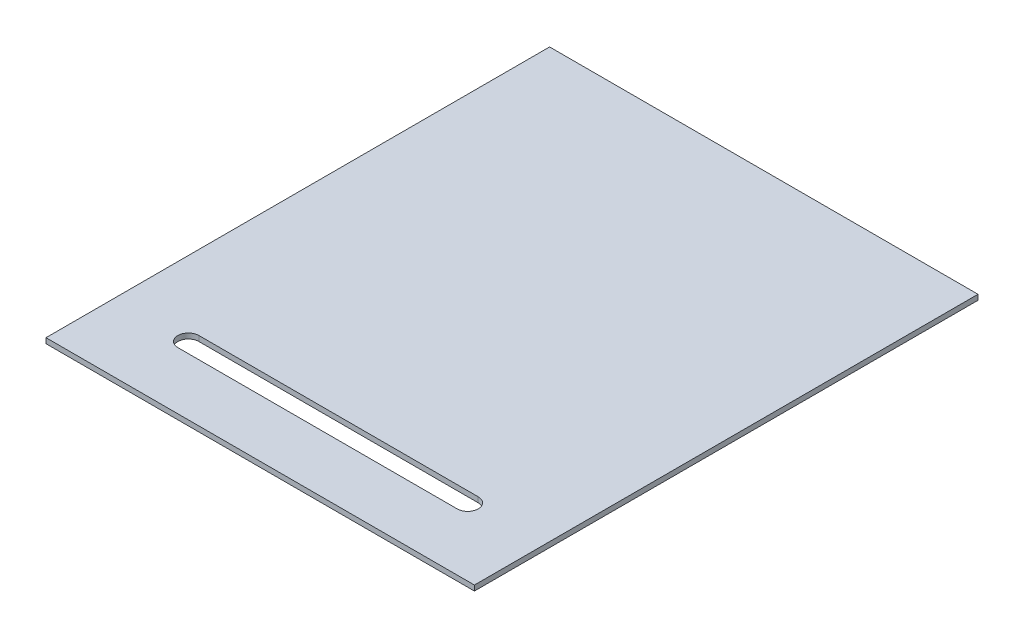
ISO-10303-21;
HEADER;
FILE_DESCRIPTION(('STEP AP214'),'2;1');
FILE_NAME('part.step','',(''),(''),'','','');
FILE_SCHEMA(('AUTOMOTIVE_DESIGN { 1 0 10303 214 1 1 1 1 }'));
ENDSEC;
DATA;
#1=APPLICATION_CONTEXT('core data for automotive mechanical design processes');
#2=APPLICATION_PROTOCOL_DEFINITION('international standard','automotive_design',2000,#1);
#3=PRODUCT_CONTEXT('',#1,'mechanical');
#4=PRODUCT('Part','Part','',(#3));
#5=PRODUCT_RELATED_PRODUCT_CATEGORY('part','',(#4));
#6=PRODUCT_DEFINITION_FORMATION('','',#4);
#7=PRODUCT_DEFINITION_CONTEXT('part definition',#1,'design');
#8=PRODUCT_DEFINITION('design','',#6,#7);
#9=PRODUCT_DEFINITION_SHAPE('','',#8);
#10=(LENGTH_UNIT() NAMED_UNIT(*) SI_UNIT(.MILLI.,.METRE.));
#11=(NAMED_UNIT(*) PLANE_ANGLE_UNIT() SI_UNIT($,.RADIAN.));
#12=(NAMED_UNIT(*) SI_UNIT($,.STERADIAN.) SOLID_ANGLE_UNIT());
#13=UNCERTAINTY_MEASURE_WITH_UNIT(LENGTH_MEASURE(1.E-05),#10,'distance_accuracy_value','');
#14=(GEOMETRIC_REPRESENTATION_CONTEXT(3) GLOBAL_UNCERTAINTY_ASSIGNED_CONTEXT((#13)) GLOBAL_UNIT_ASSIGNED_CONTEXT((#10,
#11,#12)) REPRESENTATION_CONTEXT('',''));
#15=CARTESIAN_POINT('',(0.,0.,0.));
#16=DIRECTION('',(0.,0.,1.));
#17=DIRECTION('',(1.,0.,0.));
#18=AXIS2_PLACEMENT_3D('',#15,#16,#17);
#19=CARTESIAN_POINT('',(0.,3.175,0.));
#20=DIRECTION('',(0.,1.,0.));
#21=DIRECTION('',(0.,0.,1.));
#22=AXIS2_PLACEMENT_3D('',#19,#20,#21);
#23=PLANE('',#22);
#24=DIRECTION('',(0.,0.,-1.));
#25=VECTOR('',#24,1.);
#26=CARTESIAN_POINT('',(129.54,3.175,-152.273));
#27=LINE('',#26,#25);
#28=CARTESIAN_POINT('',(129.54,3.175,152.273));
#29=VERTEX_POINT('',#28);
#30=CARTESIAN_POINT('',(129.54,3.175,-152.273));
#31=VERTEX_POINT('',#30);
#32=EDGE_CURVE('E157',#29,#31,#27,.T.);
#33=ORIENTED_EDGE('',*,*,#32,.T.);
#34=DIRECTION('',(-1.,0.,0.));
#35=VECTOR('',#34,1.);
#36=CARTESIAN_POINT('',(-129.54,3.175,-152.273));
#37=LINE('',#36,#35);
#38=CARTESIAN_POINT('',(-129.54,3.175,-152.273));
#39=VERTEX_POINT('',#38);
#40=EDGE_CURVE('E161',#31,#39,#37,.T.);
#41=ORIENTED_EDGE('',*,*,#40,.T.);
#42=DIRECTION('',(0.,0.,1.));
#43=VECTOR('',#42,1.);
#44=CARTESIAN_POINT('',(-129.54,3.175,-152.273));
#45=LINE('',#44,#43);
#46=CARTESIAN_POINT('',(-129.54,3.175,152.273));
#47=VERTEX_POINT('',#46);
#48=EDGE_CURVE('E165',#39,#47,#45,.T.);
#49=ORIENTED_EDGE('',*,*,#48,.T.);
#50=DIRECTION('',(1.,0.,0.));
#51=VECTOR('',#50,1.);
#52=CARTESIAN_POINT('',(-129.54,3.175,152.273));
#53=LINE('',#52,#51);
#54=EDGE_CURVE('E168',#47,#29,#53,.T.);
#55=ORIENTED_EDGE('',*,*,#54,.T.);
#56=EDGE_LOOP('',(#33,#41,#49,#55));
#57=FACE_BOUND('',#56,.T.);
#58=DIRECTION('',(1.,0.,0.));
#59=VECTOR('',#58,1.);
#60=CARTESIAN_POINT('',(-84.455,3.175,117.602));
#61=LINE('',#60,#59);
#62=CARTESIAN_POINT('',(-84.455,3.175,117.602));
#63=VERTEX_POINT('',#62);
#64=CARTESIAN_POINT('',(84.455,3.175,117.602));
#65=VERTEX_POINT('',#64);
#66=EDGE_CURVE('E118',#63,#65,#61,.T.);
#67=ORIENTED_EDGE('',*,*,#66,.F.);
#68=CARTESIAN_POINT('',(-84.455,3.175,111.252));
#69=DIRECTION('',(0.,1.,0.));
#70=DIRECTION('',(0.,0.,1.));
#71=AXIS2_PLACEMENT_3D('',#68,#69,#70);
#72=CIRCLE('',#71,6.34999999999999);
#73=CARTESIAN_POINT('',(-84.455,3.175,104.902));
#74=VERTEX_POINT('',#73);
#75=EDGE_CURVE('E109',#74,#63,#72,.T.);
#76=ORIENTED_EDGE('',*,*,#75,.F.);
#77=DIRECTION('',(-1.,0.,0.));
#78=VECTOR('',#77,1.);
#79=CARTESIAN_POINT('',(-84.455,3.175,104.902));
#80=LINE('',#79,#78);
#81=CARTESIAN_POINT('',(84.455,3.175,104.902));
#82=VERTEX_POINT('',#81);
#83=EDGE_CURVE('E135',#82,#74,#80,.T.);
#84=ORIENTED_EDGE('',*,*,#83,.F.);
#85=CARTESIAN_POINT('',(84.455,3.175,111.252));
#86=DIRECTION('',(0.,1.,0.));
#87=DIRECTION('',(0.,0.,1.));
#88=AXIS2_PLACEMENT_3D('',#85,#86,#87);
#89=CIRCLE('',#88,6.34999999999999);
#90=EDGE_CURVE('E131',#65,#82,#89,.T.);
#91=ORIENTED_EDGE('',*,*,#90,.F.);
#92=EDGE_LOOP('',(#67,#76,#84,#91));
#93=FACE_BOUND('',#92,.T.);
#94=ADVANCED_FACE('F43',(#57,#93),#23,.T.);
#95=CARTESIAN_POINT('',(0.,0.,0.));
#96=DIRECTION('',(0.,1.,0.));
#97=DIRECTION('',(0.,0.,1.));
#98=AXIS2_PLACEMENT_3D('',#95,#96,#97);
#99=PLANE('',#98);
#100=DIRECTION('',(0.,0.,-1.));
#101=VECTOR('',#100,1.);
#102=CARTESIAN_POINT('',(129.54,0.,-152.273));
#103=LINE('',#102,#101);
#104=CARTESIAN_POINT('',(129.54,0.,152.273));
#105=VERTEX_POINT('',#104);
#106=CARTESIAN_POINT('',(129.54,0.,-152.273));
#107=VERTEX_POINT('',#106);
#108=EDGE_CURVE('E127',#105,#107,#103,.T.);
#109=ORIENTED_EDGE('',*,*,#108,.F.);
#110=DIRECTION('',(1.,0.,0.));
#111=VECTOR('',#110,1.);
#112=CARTESIAN_POINT('',(-129.54,0.,152.273));
#113=LINE('',#112,#111);
#114=CARTESIAN_POINT('',(-129.54,0.,152.273));
#115=VERTEX_POINT('',#114);
#116=EDGE_CURVE('E162',#115,#105,#113,.T.);
#117=ORIENTED_EDGE('',*,*,#116,.F.);
#118=DIRECTION('',(0.,0.,1.));
#119=VECTOR('',#118,1.);
#120=CARTESIAN_POINT('',(-129.54,0.,-152.273));
#121=LINE('',#120,#119);
#122=CARTESIAN_POINT('',(-129.54,0.,-152.273));
#123=VERTEX_POINT('',#122);
#124=EDGE_CURVE('E178',#123,#115,#121,.T.);
#125=ORIENTED_EDGE('',*,*,#124,.F.);
#126=DIRECTION('',(-1.,0.,0.));
#127=VECTOR('',#126,1.);
#128=CARTESIAN_POINT('',(-129.54,0.,-152.273));
#129=LINE('',#128,#127);
#130=EDGE_CURVE('E175',#107,#123,#129,.T.);
#131=ORIENTED_EDGE('',*,*,#130,.F.);
#132=EDGE_LOOP('',(#109,#117,#125,#131));
#133=FACE_BOUND('',#132,.T.);
#134=CARTESIAN_POINT('',(-84.455,0.,111.252));
#135=DIRECTION('',(0.,1.,0.));
#136=DIRECTION('',(0.,0.,1.));
#137=AXIS2_PLACEMENT_3D('',#134,#135,#136);
#138=CIRCLE('',#137,6.34999999999999);
#139=CARTESIAN_POINT('',(-84.455,0.,104.902));
#140=VERTEX_POINT('',#139);
#141=CARTESIAN_POINT('',(-84.455,0.,117.602));
#142=VERTEX_POINT('',#141);
#143=EDGE_CURVE('E67',#140,#142,#138,.T.);
#144=ORIENTED_EDGE('',*,*,#143,.T.);
#145=DIRECTION('',(1.,0.,0.));
#146=VECTOR('',#145,1.);
#147=CARTESIAN_POINT('',(-84.455,0.,117.602));
#148=LINE('',#147,#146);
#149=CARTESIAN_POINT('',(84.455,0.,117.602));
#150=VERTEX_POINT('',#149);
#151=EDGE_CURVE('E125',#142,#150,#148,.T.);
#152=ORIENTED_EDGE('',*,*,#151,.T.);
#153=CARTESIAN_POINT('',(84.455,0.,111.252));
#154=DIRECTION('',(0.,1.,0.));
#155=DIRECTION('',(0.,0.,1.));
#156=AXIS2_PLACEMENT_3D('',#153,#154,#155);
#157=CIRCLE('',#156,6.34999999999999);
#158=CARTESIAN_POINT('',(84.455,0.,104.902));
#159=VERTEX_POINT('',#158);
#160=EDGE_CURVE('E144',#150,#159,#157,.T.);
#161=ORIENTED_EDGE('',*,*,#160,.T.);
#162=DIRECTION('',(-1.,0.,0.));
#163=VECTOR('',#162,1.);
#164=CARTESIAN_POINT('',(-84.455,0.,104.902));
#165=LINE('',#164,#163);
#166=EDGE_CURVE('E119',#159,#140,#165,.T.);
#167=ORIENTED_EDGE('',*,*,#166,.T.);
#168=EDGE_LOOP('',(#144,#152,#161,#167));
#169=FACE_BOUND('',#168,.T.);
#170=ADVANCED_FACE('F201',(#133,#169),#99,.F.);
#171=CARTESIAN_POINT('',(129.54,3.175,-152.273));
#172=DIRECTION('',(-1.,0.,0.));
#173=DIRECTION('',(0.,0.,1.));
#174=AXIS2_PLACEMENT_3D('',#171,#172,#173);
#175=PLANE('',#174);
#176=ORIENTED_EDGE('',*,*,#108,.T.);
#177=DIRECTION('',(0.,-1.,0.));
#178=VECTOR('',#177,1.);
#179=CARTESIAN_POINT('',(129.54,3.175,-152.273));
#180=LINE('',#179,#178);
#181=EDGE_CURVE('E11',#31,#107,#180,.T.);
#182=ORIENTED_EDGE('',*,*,#181,.F.);
#183=ORIENTED_EDGE('',*,*,#32,.F.);
#184=DIRECTION('',(0.,-1.,0.));
#185=VECTOR('',#184,1.);
#186=CARTESIAN_POINT('',(129.54,3.175,152.273));
#187=LINE('',#186,#185);
#188=EDGE_CURVE('E171',#29,#105,#187,.T.);
#189=ORIENTED_EDGE('',*,*,#188,.T.);
#190=EDGE_LOOP('',(#176,#182,#183,#189));
#191=FACE_BOUND('',#190,.T.);
#192=ADVANCED_FACE('F45',(#191),#175,.F.);
#193=CARTESIAN_POINT('',(-129.54,3.175,-152.273));
#194=DIRECTION('',(0.,0.,1.));
#195=DIRECTION('',(1.,0.,0.));
#196=AXIS2_PLACEMENT_3D('',#193,#194,#195);
#197=PLANE('',#196);
#198=ORIENTED_EDGE('',*,*,#130,.T.);
#199=DIRECTION('',(0.,-1.,0.));
#200=VECTOR('',#199,1.);
#201=CARTESIAN_POINT('',(-129.54,3.175,-152.273));
#202=LINE('',#201,#200);
#203=EDGE_CURVE('E52',#39,#123,#202,.T.);
#204=ORIENTED_EDGE('',*,*,#203,.F.);
#205=ORIENTED_EDGE('',*,*,#40,.F.);
#206=ORIENTED_EDGE('',*,*,#181,.T.);
#207=EDGE_LOOP('',(#198,#204,#205,#206));
#208=FACE_BOUND('',#207,.T.);
#209=ADVANCED_FACE('F211',(#208),#197,.F.);
#210=CARTESIAN_POINT('',(-129.54,3.175,-152.273));
#211=DIRECTION('',(1.,0.,0.));
#212=DIRECTION('',(0.,0.,-1.));
#213=AXIS2_PLACEMENT_3D('',#210,#211,#212);
#214=PLANE('',#213);
#215=ORIENTED_EDGE('',*,*,#124,.T.);
#216=DIRECTION('',(0.,-1.,0.));
#217=VECTOR('',#216,1.);
#218=CARTESIAN_POINT('',(-129.54,3.175,152.273));
#219=LINE('',#218,#217);
#220=EDGE_CURVE('E186',#47,#115,#219,.T.);
#221=ORIENTED_EDGE('',*,*,#220,.F.);
#222=ORIENTED_EDGE('',*,*,#48,.F.);
#223=ORIENTED_EDGE('',*,*,#203,.T.);
#224=EDGE_LOOP('',(#215,#221,#222,#223));
#225=FACE_BOUND('',#224,.T.);
#226=ADVANCED_FACE('F195',(#225),#214,.F.);
#227=CARTESIAN_POINT('',(-129.54,3.175,152.273));
#228=DIRECTION('',(0.,0.,-1.));
#229=DIRECTION('',(-1.,0.,0.));
#230=AXIS2_PLACEMENT_3D('',#227,#228,#229);
#231=PLANE('',#230);
#232=ORIENTED_EDGE('',*,*,#116,.T.);
#233=ORIENTED_EDGE('',*,*,#188,.F.);
#234=ORIENTED_EDGE('',*,*,#54,.F.);
#235=ORIENTED_EDGE('',*,*,#220,.T.);
#236=EDGE_LOOP('',(#232,#233,#234,#235));
#237=FACE_BOUND('',#236,.T.);
#238=ADVANCED_FACE('F205',(#237),#231,.F.);
#239=CARTESIAN_POINT('',(-84.455,3.175,111.252));
#240=DIRECTION('',(0.,-1.,0.));
#241=DIRECTION('',(0.,0.,-1.));
#242=AXIS2_PLACEMENT_3D('',#239,#240,#241);
#243=CYLINDRICAL_SURFACE('',#242,6.34999999999999);
#244=ORIENTED_EDGE('',*,*,#143,.F.);
#245=DIRECTION('',(0.,-1.,0.));
#246=VECTOR('',#245,1.);
#247=CARTESIAN_POINT('',(-84.455,3.175,104.902));
#248=LINE('',#247,#246);
#249=EDGE_CURVE('E113',#74,#140,#248,.T.);
#250=ORIENTED_EDGE('',*,*,#249,.F.);
#251=ORIENTED_EDGE('',*,*,#75,.T.);
#252=DIRECTION('',(0.,-1.,0.));
#253=VECTOR('',#252,1.);
#254=CARTESIAN_POINT('',(-84.455,3.175,117.602));
#255=LINE('',#254,#253);
#256=EDGE_CURVE('E112',#63,#142,#255,.T.);
#257=ORIENTED_EDGE('',*,*,#256,.T.);
#258=EDGE_LOOP('',(#244,#250,#251,#257));
#259=FACE_BOUND('',#258,.T.);
#260=ADVANCED_FACE('F111',(#259),#243,.F.);
#261=CARTESIAN_POINT('',(-84.455,3.175,117.602));
#262=DIRECTION('',(0.,0.,-1.));
#263=DIRECTION('',(-1.,0.,0.));
#264=AXIS2_PLACEMENT_3D('',#261,#262,#263);
#265=PLANE('',#264);
#266=ORIENTED_EDGE('',*,*,#151,.F.);
#267=ORIENTED_EDGE('',*,*,#256,.F.);
#268=ORIENTED_EDGE('',*,*,#66,.T.);
#269=DIRECTION('',(0.,-1.,0.));
#270=VECTOR('',#269,1.);
#271=CARTESIAN_POINT('',(84.455,3.175,117.602));
#272=LINE('',#271,#270);
#273=EDGE_CURVE('E128',#65,#150,#272,.T.);
#274=ORIENTED_EDGE('',*,*,#273,.T.);
#275=EDGE_LOOP('',(#266,#267,#268,#274));
#276=FACE_BOUND('',#275,.T.);
#277=ADVANCED_FACE('F122',(#276),#265,.T.);
#278=CARTESIAN_POINT('',(84.455,3.175,111.252));
#279=DIRECTION('',(0.,-1.,0.));
#280=DIRECTION('',(0.,0.,-1.));
#281=AXIS2_PLACEMENT_3D('',#278,#279,#280);
#282=CYLINDRICAL_SURFACE('',#281,6.34999999999999);
#283=ORIENTED_EDGE('',*,*,#160,.F.);
#284=ORIENTED_EDGE('',*,*,#273,.F.);
#285=ORIENTED_EDGE('',*,*,#90,.T.);
#286=DIRECTION('',(0.,-1.,0.));
#287=VECTOR('',#286,1.);
#288=CARTESIAN_POINT('',(84.455,3.175,104.902));
#289=LINE('',#288,#287);
#290=EDGE_CURVE('E59',#82,#159,#289,.T.);
#291=ORIENTED_EDGE('',*,*,#290,.T.);
#292=EDGE_LOOP('',(#283,#284,#285,#291));
#293=FACE_BOUND('',#292,.T.);
#294=ADVANCED_FACE('F234',(#293),#282,.F.);
#295=CARTESIAN_POINT('',(-84.455,3.175,104.902));
#296=DIRECTION('',(0.,0.,1.));
#297=DIRECTION('',(1.,0.,0.));
#298=AXIS2_PLACEMENT_3D('',#295,#296,#297);
#299=PLANE('',#298);
#300=ORIENTED_EDGE('',*,*,#166,.F.);
#301=ORIENTED_EDGE('',*,*,#290,.F.);
#302=ORIENTED_EDGE('',*,*,#83,.T.);
#303=ORIENTED_EDGE('',*,*,#249,.T.);
#304=EDGE_LOOP('',(#300,#301,#302,#303));
#305=FACE_BOUND('',#304,.T.);
#306=ADVANCED_FACE('F238',(#305),#299,.T.);
#307=CLOSED_SHELL('',(#94,#170,#192,#209,#226,#238,#260,#277,#294,#306));
#308=MANIFOLD_SOLID_BREP('B2',#307);
#309=ADVANCED_BREP_SHAPE_REPRESENTATION('',(#18,#308),#14);
#310=SHAPE_DEFINITION_REPRESENTATION(#9,#309);
ENDSEC;
END-ISO-10303-21;
